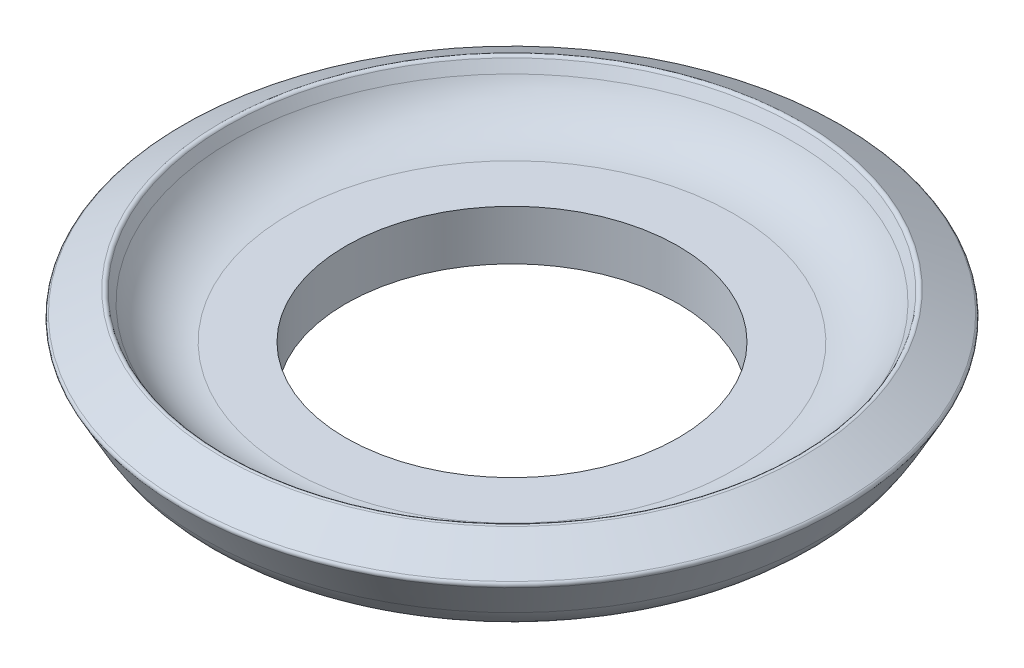
ISO-10303-21;
HEADER;
FILE_DESCRIPTION(('STEP AP214'),'2;1');
FILE_NAME('part.step','',(''),(''),'','','');
FILE_SCHEMA(('AUTOMOTIVE_DESIGN { 1 0 10303 214 1 1 1 1 }'));
ENDSEC;
DATA;
#1=APPLICATION_CONTEXT('core data for automotive mechanical design processes');
#2=APPLICATION_PROTOCOL_DEFINITION('international standard','automotive_design',2000,#1);
#3=PRODUCT_CONTEXT('',#1,'mechanical');
#4=PRODUCT('Part','Part','',(#3));
#5=PRODUCT_RELATED_PRODUCT_CATEGORY('part','',(#4));
#6=PRODUCT_DEFINITION_FORMATION('','',#4);
#7=PRODUCT_DEFINITION_CONTEXT('part definition',#1,'design');
#8=PRODUCT_DEFINITION('design','',#6,#7);
#9=PRODUCT_DEFINITION_SHAPE('','',#8);
#10=(LENGTH_UNIT() NAMED_UNIT(*) SI_UNIT(.MILLI.,.METRE.));
#11=(NAMED_UNIT(*) PLANE_ANGLE_UNIT() SI_UNIT($,.RADIAN.));
#12=(NAMED_UNIT(*) SI_UNIT($,.STERADIAN.) SOLID_ANGLE_UNIT());
#13=UNCERTAINTY_MEASURE_WITH_UNIT(LENGTH_MEASURE(1.E-05),#10,'distance_accuracy_value','');
#14=(GEOMETRIC_REPRESENTATION_CONTEXT(3) GLOBAL_UNCERTAINTY_ASSIGNED_CONTEXT((#13)) GLOBAL_UNIT_ASSIGNED_CONTEXT((#10,
#11,#12)) REPRESENTATION_CONTEXT('',''));
#15=CARTESIAN_POINT('',(0.,0.,0.));
#16=DIRECTION('',(0.,0.,1.));
#17=DIRECTION('',(1.,0.,0.));
#18=AXIS2_PLACEMENT_3D('',#15,#16,#17);
#19=CARTESIAN_POINT('',(0.,4.37115044906022,0.));
#20=DIRECTION('',(0.,1.,0.));
#21=DIRECTION('',(0.,0.,1.));
#22=AXIS2_PLACEMENT_3D('',#19,#20,#21);
#23=CYLINDRICAL_SURFACE('',#22,5.);
#24=CARTESIAN_POINT('',(0.,1.17640611567636,0.));
#25=DIRECTION('',(0.,1.,0.));
#26=DIRECTION('',(0.,0.,1.));
#27=AXIS2_PLACEMENT_3D('',#24,#25,#26);
#28=CIRCLE('',#27,5.);
#29=CARTESIAN_POINT('',(0.,1.17640611567636,5.));
#30=VERTEX_POINT('',#29);
#31=EDGE_CURVE('E10',#30,#30,#28,.T.);
#32=ORIENTED_EDGE('',*,*,#31,.F.);
#33=EDGE_LOOP('',(#32));
#34=FACE_BOUND('',#33,.T.);
#35=CARTESIAN_POINT('',(0.,2.67640611567636,0.));
#36=DIRECTION('',(0.,1.,0.));
#37=DIRECTION('',(0.,0.,1.));
#38=AXIS2_PLACEMENT_3D('',#35,#36,#37);
#39=CIRCLE('',#38,5.);
#40=CARTESIAN_POINT('',(0.,2.67640611567636,5.));
#41=VERTEX_POINT('',#40);
#42=EDGE_CURVE('E67',#41,#41,#39,.T.);
#43=ORIENTED_EDGE('',*,*,#42,.T.);
#44=EDGE_LOOP('',(#43));
#45=FACE_BOUND('',#44,.T.);
#46=ADVANCED_FACE('F33',(#34,#45),#23,.F.);
#47=CARTESIAN_POINT('',(5.,1.17640611567636,0.));
#48=DIRECTION('',(0.,1.,0.));
#49=DIRECTION('',(0.,0.,1.));
#50=AXIS2_PLACEMENT_3D('',#47,#48,#49);
#51=PLANE('',#50);
#52=CARTESIAN_POINT('',(0.,1.17640611567636,0.));
#53=DIRECTION('',(0.,1.,0.));
#54=DIRECTION('',(0.,0.,1.));
#55=AXIS2_PLACEMENT_3D('',#52,#53,#54);
#56=CIRCLE('',#55,7.55809395532634);
#57=CARTESIAN_POINT('',(0.,1.17640611567636,7.55809395532634));
#58=VERTEX_POINT('',#57);
#59=EDGE_CURVE('E39',#58,#58,#56,.T.);
#60=ORIENTED_EDGE('',*,*,#59,.F.);
#61=EDGE_LOOP('',(#60));
#62=FACE_BOUND('',#61,.T.);
#63=ORIENTED_EDGE('',*,*,#31,.T.);
#64=EDGE_LOOP('',(#63));
#65=FACE_BOUND('',#64,.T.);
#66=ADVANCED_FACE('F116',(#62,#65),#51,.F.);
#67=CARTESIAN_POINT('',(0.,3.17640611567636,0.));
#68=DIRECTION('',(0.,1.,0.));
#69=DIRECTION('',(0.,0.,1.));
#70=AXIS2_PLACEMENT_3D('',#67,#68,#69);
#71=TOROIDAL_SURFACE('',#70,7.55809395532634,2.);
#72=CARTESIAN_POINT('',(0.,2.20319834829752,0.));
#73=DIRECTION('',(0.,1.,0.));
#74=DIRECTION('',(0.,0.,1.));
#75=AXIS2_PLACEMENT_3D('',#72,#73,#74);
#76=CIRCLE('',#75,9.30533939930767);
#77=CARTESIAN_POINT('',(0.,2.20319834829752,9.30533939930767));
#78=VERTEX_POINT('',#77);
#79=EDGE_CURVE('E43',#78,#78,#76,.T.);
#80=ORIENTED_EDGE('',*,*,#79,.F.);
#81=EDGE_LOOP('',(#80));
#82=FACE_BOUND('',#81,.T.);
#83=ORIENTED_EDGE('',*,*,#59,.T.);
#84=EDGE_LOOP('',(#83));
#85=FACE_BOUND('',#84,.T.);
#86=ADVANCED_FACE('F111',(#82,#85),#71,.T.);
#87=CARTESIAN_POINT('',(0.,2.20319834829752,0.));
#88=DIRECTION('',(0.,1.,0.));
#89=DIRECTION('',(0.,0.,1.));
#90=AXIS2_PLACEMENT_3D('',#87,#88,#89);
#91=CONICAL_SURFACE('',#90,9.30533939930767,0.508198130678249);
#92=CARTESIAN_POINT('',(0.,3.27310064845395,0.));
#93=DIRECTION('',(0.,1.,0.));
#94=DIRECTION('',(0.,0.,1.));
#95=AXIS2_PLACEMENT_3D('',#92,#93,#94);
#96=CIRCLE('',#95,9.90127011553042);
#97=CARTESIAN_POINT('',(0.,3.27310064845395,9.90127011553042));
#98=VERTEX_POINT('',#97);
#99=EDGE_CURVE('E47',#98,#98,#96,.T.);
#100=ORIENTED_EDGE('',*,*,#99,.F.);
#101=EDGE_LOOP('',(#100));
#102=FACE_BOUND('',#101,.T.);
#103=ORIENTED_EDGE('',*,*,#79,.T.);
#104=EDGE_LOOP('',(#103));
#105=FACE_BOUND('',#104,.T.);
#106=ADVANCED_FACE('F105',(#102,#105),#91,.T.);
#107=CARTESIAN_POINT('',(0.,3.32176103682289,0.));
#108=DIRECTION('',(0.,1.,0.));
#109=DIRECTION('',(0.,0.,1.));
#110=AXIS2_PLACEMENT_3D('',#107,#108,#109);
#111=TOROIDAL_SURFACE('',#110,9.81390784333135,0.1);
#112=CARTESIAN_POINT('',(0.,3.40912330902196,0.));
#113=DIRECTION('',(0.,1.,0.));
#114=DIRECTION('',(0.,0.,1.));
#115=AXIS2_PLACEMENT_3D('',#112,#113,#114);
#116=CIRCLE('',#115,9.86256823170029);
#117=CARTESIAN_POINT('',(0.,3.40912330902196,9.86256823170029));
#118=VERTEX_POINT('',#117);
#119=EDGE_CURVE('E52',#118,#118,#116,.T.);
#120=ORIENTED_EDGE('',*,*,#119,.F.);
#121=EDGE_LOOP('',(#120));
#122=FACE_BOUND('',#121,.T.);
#123=ORIENTED_EDGE('',*,*,#99,.T.);
#124=EDGE_LOOP('',(#123));
#125=FACE_BOUND('',#124,.T.);
#126=ADVANCED_FACE('F99',(#122,#125),#111,.T.);
#127=CARTESIAN_POINT('',(0.,3.40912330902196,0.));
#128=DIRECTION('',(0.,-1.,0.));
#129=DIRECTION('',(0.,0.,-1.));
#130=AXIS2_PLACEMENT_3D('',#127,#128,#129);
#131=CONICAL_SURFACE('',#130,9.86256823170029,1.06259819611665);
#132=CARTESIAN_POINT('',(0.,4.04170835781821,0.));
#133=DIRECTION('',(0.,1.,0.));
#134=DIRECTION('',(0.,0.,1.));
#135=AXIS2_PLACEMENT_3D('',#132,#133,#134);
#136=CIRCLE('',#135,8.72685869311243);
#137=CARTESIAN_POINT('',(0.,4.04170835781821,8.72685869311243));
#138=VERTEX_POINT('',#137);
#139=EDGE_CURVE('E55',#138,#138,#136,.T.);
#140=ORIENTED_EDGE('',*,*,#139,.F.);
#141=EDGE_LOOP('',(#140));
#142=FACE_BOUND('',#141,.T.);
#143=ORIENTED_EDGE('',*,*,#119,.T.);
#144=EDGE_LOOP('',(#143));
#145=FACE_BOUND('',#144,.T.);
#146=ADVANCED_FACE('F93',(#142,#145),#131,.T.);
#147=CARTESIAN_POINT('',(0.,3.95434608561914,0.));
#148=DIRECTION('',(0.,1.,0.));
#149=DIRECTION('',(0.,0.,1.));
#150=AXIS2_PLACEMENT_3D('',#147,#148,#149);
#151=TOROIDAL_SURFACE('',#150,8.67819830474349,0.0999999999999997);
#152=CARTESIAN_POINT('',(0.,4.00300647398808,0.));
#153=DIRECTION('',(0.,1.,0.));
#154=DIRECTION('',(0.,0.,1.));
#155=AXIS2_PLACEMENT_3D('',#152,#153,#154);
#156=CIRCLE('',#155,8.59083603254443);
#157=CARTESIAN_POINT('',(0.,4.00300647398808,8.59083603254443));
#158=VERTEX_POINT('',#157);
#159=EDGE_CURVE('E58',#158,#158,#156,.T.);
#160=ORIENTED_EDGE('',*,*,#159,.F.);
#161=EDGE_LOOP('',(#160));
#162=FACE_BOUND('',#161,.T.);
#163=ORIENTED_EDGE('',*,*,#139,.T.);
#164=EDGE_LOOP('',(#163));
#165=FACE_BOUND('',#164,.T.);
#166=ADVANCED_FACE('F87',(#162,#165),#151,.T.);
#167=CARTESIAN_POINT('',(0.,4.00300647398808,0.));
#168=DIRECTION('',(0.,1.,0.));
#169=DIRECTION('',(0.,0.,1.));
#170=AXIS2_PLACEMENT_3D('',#167,#168,#169);
#171=CONICAL_SURFACE('',#170,8.59083603254443,0.508198130678249);
#172=CARTESIAN_POINT('',(0.,3.70319834829752,0.));
#173=DIRECTION('',(0.,1.,0.));
#174=DIRECTION('',(0.,0.,1.));
#175=AXIS2_PLACEMENT_3D('',#172,#173,#174);
#176=CIRCLE('',#175,8.42384426979557);
#177=CARTESIAN_POINT('',(0.,3.70319834829752,8.42384426979557));
#178=VERTEX_POINT('',#177);
#179=EDGE_CURVE('E61',#178,#178,#176,.T.);
#180=ORIENTED_EDGE('',*,*,#179,.F.);
#181=EDGE_LOOP('',(#180));
#182=FACE_BOUND('',#181,.T.);
#183=ORIENTED_EDGE('',*,*,#159,.T.);
#184=EDGE_LOOP('',(#183));
#185=FACE_BOUND('',#184,.T.);
#186=ADVANCED_FACE('F81',(#182,#185),#171,.F.);
#187=CARTESIAN_POINT('',(0.,4.67640611567636,0.));
#188=DIRECTION('',(0.,1.,0.));
#189=DIRECTION('',(0.,0.,1.));
#190=AXIS2_PLACEMENT_3D('',#187,#188,#189);
#191=TOROIDAL_SURFACE('',#190,6.67659882581425,2.);
#192=CARTESIAN_POINT('',(0.,2.67640611567636,0.));
#193=DIRECTION('',(0.,1.,0.));
#194=DIRECTION('',(0.,0.,1.));
#195=AXIS2_PLACEMENT_3D('',#192,#193,#194);
#196=CIRCLE('',#195,6.67659882581425);
#197=CARTESIAN_POINT('',(0.,2.67640611567636,6.67659882581425));
#198=VERTEX_POINT('',#197);
#199=EDGE_CURVE('E64',#198,#198,#196,.T.);
#200=ORIENTED_EDGE('',*,*,#199,.F.);
#201=EDGE_LOOP('',(#200));
#202=FACE_BOUND('',#201,.T.);
#203=ORIENTED_EDGE('',*,*,#179,.T.);
#204=EDGE_LOOP('',(#203));
#205=FACE_BOUND('',#204,.T.);
#206=ADVANCED_FACE('F75',(#202,#205),#191,.F.);
#207=CARTESIAN_POINT('',(6.67659882581425,2.67640611567636,0.));
#208=DIRECTION('',(0.,-1.,0.));
#209=DIRECTION('',(0.,0.,-1.));
#210=AXIS2_PLACEMENT_3D('',#207,#208,#209);
#211=PLANE('',#210);
#212=ORIENTED_EDGE('',*,*,#42,.F.);
#213=EDGE_LOOP('',(#212));
#214=FACE_BOUND('',#213,.T.);
#215=ORIENTED_EDGE('',*,*,#199,.T.);
#216=EDGE_LOOP('',(#215));
#217=FACE_BOUND('',#216,.T.);
#218=ADVANCED_FACE('F72',(#214,#217),#211,.F.);
#219=CLOSED_SHELL('',(#46,#66,#86,#106,#126,#146,#166,#186,#206,#218));
#220=MANIFOLD_SOLID_BREP('B2',#219);
#221=ADVANCED_BREP_SHAPE_REPRESENTATION('',(#18,#220),#14);
#222=SHAPE_DEFINITION_REPRESENTATION(#9,#221);
ENDSEC;
END-ISO-10303-21;
